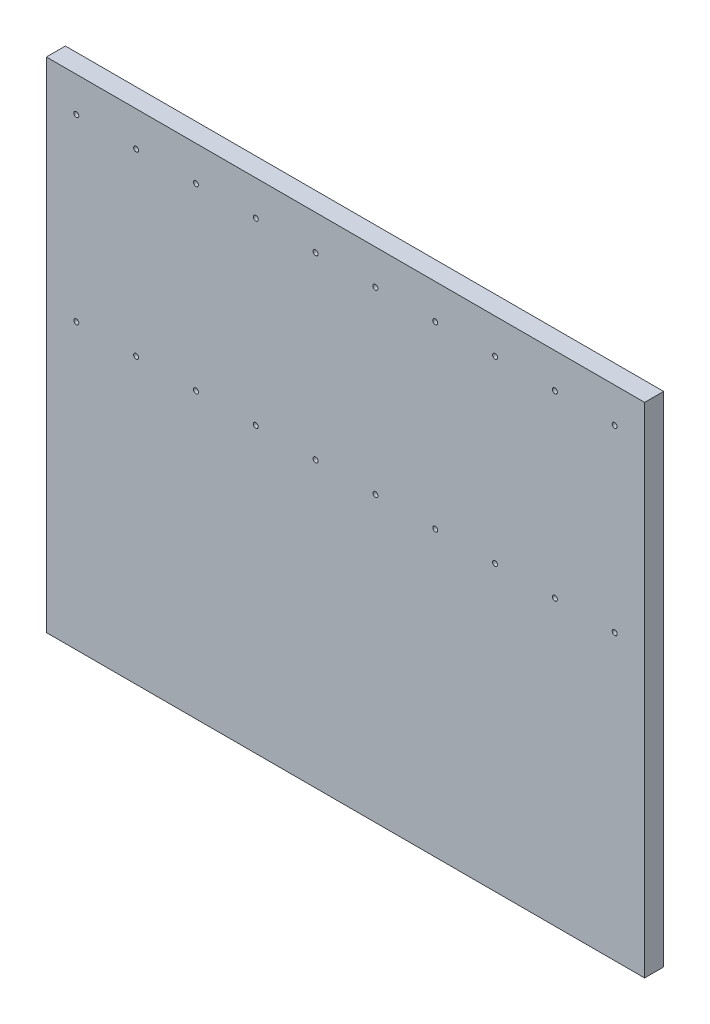
ISO-10303-21;
HEADER;
FILE_DESCRIPTION(('STEP AP214'),'2;1');
FILE_NAME('part.step','',(''),(''),'','','');
FILE_SCHEMA(('AUTOMOTIVE_DESIGN { 1 0 10303 214 1 1 1 1 }'));
ENDSEC;
DATA;
#1=APPLICATION_CONTEXT('core data for automotive mechanical design processes');
#2=APPLICATION_PROTOCOL_DEFINITION('international standard','automotive_design',2000,#1);
#3=PRODUCT_CONTEXT('',#1,'mechanical');
#4=PRODUCT('Part','Part','',(#3));
#5=PRODUCT_RELATED_PRODUCT_CATEGORY('part','',(#4));
#6=PRODUCT_DEFINITION_FORMATION('','',#4);
#7=PRODUCT_DEFINITION_CONTEXT('part definition',#1,'design');
#8=PRODUCT_DEFINITION('design','',#6,#7);
#9=PRODUCT_DEFINITION_SHAPE('','',#8);
#10=(LENGTH_UNIT() NAMED_UNIT(*) SI_UNIT(.MILLI.,.METRE.));
#11=(NAMED_UNIT(*) PLANE_ANGLE_UNIT() SI_UNIT($,.RADIAN.));
#12=(NAMED_UNIT(*) SI_UNIT($,.STERADIAN.) SOLID_ANGLE_UNIT());
#13=UNCERTAINTY_MEASURE_WITH_UNIT(LENGTH_MEASURE(1.E-05),#10,'distance_accuracy_value','');
#14=(GEOMETRIC_REPRESENTATION_CONTEXT(3) GLOBAL_UNCERTAINTY_ASSIGNED_CONTEXT((#13)) GLOBAL_UNIT_ASSIGNED_CONTEXT((#10,
#11,#12)) REPRESENTATION_CONTEXT('',''));
#15=CARTESIAN_POINT('',(0.,0.,0.));
#16=DIRECTION('',(0.,0.,1.));
#17=DIRECTION('',(1.,0.,0.));
#18=AXIS2_PLACEMENT_3D('',#15,#16,#17);
#19=CARTESIAN_POINT('',(0.,-250.,19.05));
#20=DIRECTION('',(0.,1.,0.));
#21=DIRECTION('',(0.,0.,1.));
#22=AXIS2_PLACEMENT_3D('',#19,#20,#21);
#23=PLANE('',#22);
#24=DIRECTION('',(1.,0.,0.));
#25=VECTOR('',#24,1.);
#26=CARTESIAN_POINT('',(0.,-250.,0.));
#27=LINE('',#26,#25);
#28=CARTESIAN_POINT('',(-300.,-250.,0.));
#29=VERTEX_POINT('',#28);
#30=CARTESIAN_POINT('',(300.,-250.,0.));
#31=VERTEX_POINT('',#30);
#32=EDGE_CURVE('E98',#29,#31,#27,.T.);
#33=ORIENTED_EDGE('',*,*,#32,.T.);
#34=DIRECTION('',(0.,0.,-1.));
#35=VECTOR('',#34,1.);
#36=CARTESIAN_POINT('',(300.,-250.,19.05));
#37=LINE('',#36,#35);
#38=CARTESIAN_POINT('',(300.,-250.,19.05));
#39=VERTEX_POINT('',#38);
#40=EDGE_CURVE('E11',#39,#31,#37,.T.);
#41=ORIENTED_EDGE('',*,*,#40,.F.);
#42=DIRECTION('',(1.,0.,0.));
#43=VECTOR('',#42,1.);
#44=CARTESIAN_POINT('',(0.,-250.,19.05));
#45=LINE('',#44,#43);
#46=CARTESIAN_POINT('',(-300.,-250.,19.05));
#47=VERTEX_POINT('',#46);
#48=EDGE_CURVE('E84',#47,#39,#45,.T.);
#49=ORIENTED_EDGE('',*,*,#48,.F.);
#50=DIRECTION('',(0.,0.,-1.));
#51=VECTOR('',#50,1.);
#52=CARTESIAN_POINT('',(-300.,-250.,19.05));
#53=LINE('',#52,#51);
#54=EDGE_CURVE('E51',#47,#29,#53,.T.);
#55=ORIENTED_EDGE('',*,*,#54,.T.);
#56=EDGE_LOOP('',(#33,#41,#49,#55));
#57=FACE_BOUND('',#56,.T.);
#58=ADVANCED_FACE('F35',(#57),#23,.F.);
#59=CARTESIAN_POINT('',(300.,0.,19.05));
#60=DIRECTION('',(-1.,0.,0.));
#61=DIRECTION('',(0.,0.,1.));
#62=AXIS2_PLACEMENT_3D('',#59,#60,#61);
#63=PLANE('',#62);
#64=DIRECTION('',(0.,1.,0.));
#65=VECTOR('',#64,1.);
#66=CARTESIAN_POINT('',(300.,0.,0.));
#67=LINE('',#66,#65);
#68=CARTESIAN_POINT('',(300.,250.,0.));
#69=VERTEX_POINT('',#68);
#70=EDGE_CURVE('E89',#31,#69,#67,.T.);
#71=ORIENTED_EDGE('',*,*,#70,.T.);
#72=DIRECTION('',(0.,0.,-1.));
#73=VECTOR('',#72,1.);
#74=CARTESIAN_POINT('',(300.,250.,19.05));
#75=LINE('',#74,#73);
#76=CARTESIAN_POINT('',(300.,250.,19.05));
#77=VERTEX_POINT('',#76);
#78=EDGE_CURVE('E43',#77,#69,#75,.T.);
#79=ORIENTED_EDGE('',*,*,#78,.F.);
#80=DIRECTION('',(0.,1.,0.));
#81=VECTOR('',#80,1.);
#82=CARTESIAN_POINT('',(300.,0.,19.05));
#83=LINE('',#82,#81);
#84=EDGE_CURVE('E77',#39,#77,#83,.T.);
#85=ORIENTED_EDGE('',*,*,#84,.F.);
#86=ORIENTED_EDGE('',*,*,#40,.T.);
#87=EDGE_LOOP('',(#71,#79,#85,#86));
#88=FACE_BOUND('',#87,.T.);
#89=ADVANCED_FACE('F88',(#88),#63,.F.);
#90=CARTESIAN_POINT('',(0.,250.,19.05));
#91=DIRECTION('',(0.,-1.,0.));
#92=DIRECTION('',(1.,0.,0.));
#93=AXIS2_PLACEMENT_3D('',#90,#91,#92);
#94=PLANE('',#93);
#95=DIRECTION('',(-1.,0.,0.));
#96=VECTOR('',#95,1.);
#97=CARTESIAN_POINT('',(0.,250.,0.));
#98=LINE('',#97,#96);
#99=CARTESIAN_POINT('',(-300.,250.,0.));
#100=VERTEX_POINT('',#99);
#101=EDGE_CURVE('E102',#69,#100,#98,.T.);
#102=ORIENTED_EDGE('',*,*,#101,.T.);
#103=DIRECTION('',(0.,0.,-1.));
#104=VECTOR('',#103,1.);
#105=CARTESIAN_POINT('',(-300.,250.,19.05));
#106=LINE('',#105,#104);
#107=CARTESIAN_POINT('',(-300.,250.,19.05));
#108=VERTEX_POINT('',#107);
#109=EDGE_CURVE('E66',#108,#100,#106,.T.);
#110=ORIENTED_EDGE('',*,*,#109,.F.);
#111=DIRECTION('',(-1.,0.,0.));
#112=VECTOR('',#111,1.);
#113=CARTESIAN_POINT('',(0.,250.,19.05));
#114=LINE('',#113,#112);
#115=EDGE_CURVE('E83',#77,#108,#114,.T.);
#116=ORIENTED_EDGE('',*,*,#115,.F.);
#117=ORIENTED_EDGE('',*,*,#78,.T.);
#118=EDGE_LOOP('',(#102,#110,#116,#117));
#119=FACE_BOUND('',#118,.T.);
#120=ADVANCED_FACE('F92',(#119),#94,.F.);
#121=CARTESIAN_POINT('',(-300.,0.,19.05));
#122=DIRECTION('',(-1.,0.,0.));
#123=DIRECTION('',(0.,0.,1.));
#124=AXIS2_PLACEMENT_3D('',#121,#122,#123);
#125=PLANE('',#124);
#126=DIRECTION('',(0.,1.,0.));
#127=VECTOR('',#126,1.);
#128=CARTESIAN_POINT('',(-300.,0.,0.));
#129=LINE('',#128,#127);
#130=EDGE_CURVE('E104',#29,#100,#129,.T.);
#131=ORIENTED_EDGE('',*,*,#130,.F.);
#132=ORIENTED_EDGE('',*,*,#54,.F.);
#133=DIRECTION('',(0.,1.,0.));
#134=VECTOR('',#133,1.);
#135=CARTESIAN_POINT('',(-300.,0.,19.05));
#136=LINE('',#135,#134);
#137=EDGE_CURVE('E93',#47,#108,#136,.T.);
#138=ORIENTED_EDGE('',*,*,#137,.T.);
#139=ORIENTED_EDGE('',*,*,#109,.T.);
#140=EDGE_LOOP('',(#131,#132,#138,#139));
#141=FACE_BOUND('',#140,.T.);
#142=ADVANCED_FACE('F242',(#141),#125,.T.);
#143=CARTESIAN_POINT('',(0.,0.,19.05));
#144=DIRECTION('',(0.,0.,1.));
#145=DIRECTION('',(1.,0.,0.));
#146=AXIS2_PLACEMENT_3D('',#143,#144,#145);
#147=PLANE('',#146);
#148=CARTESIAN_POINT('',(90.0000000000001,215.,19.05));
#149=DIRECTION('',(0.,0.,1.));
#150=DIRECTION('',(1.,0.,0.));
#151=AXIS2_PLACEMENT_3D('',#148,#149,#150);
#152=CIRCLE('',#151,2.5);
#153=CARTESIAN_POINT('',(92.5000000000001,215.,19.05));
#154=VERTEX_POINT('',#153);
#155=EDGE_CURVE('E164',#154,#154,#152,.T.);
#156=ORIENTED_EDGE('',*,*,#155,.F.);
#157=EDGE_LOOP('',(#156));
#158=FACE_BOUND('',#157,.T.);
#159=CARTESIAN_POINT('',(30.0000000000001,215.,19.05));
#160=DIRECTION('',(0.,0.,1.));
#161=DIRECTION('',(1.,0.,0.));
#162=AXIS2_PLACEMENT_3D('',#159,#160,#161);
#163=CIRCLE('',#162,2.50000000000002);
#164=CARTESIAN_POINT('',(32.5000000000001,215.,19.05));
#165=VERTEX_POINT('',#164);
#166=EDGE_CURVE('E171',#165,#165,#163,.T.);
#167=ORIENTED_EDGE('',*,*,#166,.F.);
#168=EDGE_LOOP('',(#167));
#169=FACE_BOUND('',#168,.T.);
#170=CARTESIAN_POINT('',(-29.9999999999999,215.,19.05));
#171=DIRECTION('',(0.,0.,1.));
#172=DIRECTION('',(1.,0.,0.));
#173=AXIS2_PLACEMENT_3D('',#170,#171,#172);
#174=CIRCLE('',#173,2.50000000000002);
#175=CARTESIAN_POINT('',(-27.4999999999999,215.,19.05));
#176=VERTEX_POINT('',#175);
#177=EDGE_CURVE('E177',#176,#176,#174,.T.);
#178=ORIENTED_EDGE('',*,*,#177,.F.);
#179=EDGE_LOOP('',(#178));
#180=FACE_BOUND('',#179,.T.);
#181=CARTESIAN_POINT('',(-89.9999999999999,215.,19.05));
#182=DIRECTION('',(0.,0.,1.));
#183=DIRECTION('',(1.,0.,0.));
#184=AXIS2_PLACEMENT_3D('',#181,#182,#183);
#185=CIRCLE('',#184,2.5);
#186=CARTESIAN_POINT('',(-87.4999999999999,215.,19.05));
#187=VERTEX_POINT('',#186);
#188=EDGE_CURVE('E183',#187,#187,#185,.T.);
#189=ORIENTED_EDGE('',*,*,#188,.F.);
#190=EDGE_LOOP('',(#189));
#191=FACE_BOUND('',#190,.T.);
#192=CARTESIAN_POINT('',(-150.,215.,19.05));
#193=DIRECTION('',(0.,0.,1.));
#194=DIRECTION('',(1.,0.,0.));
#195=AXIS2_PLACEMENT_3D('',#192,#193,#194);
#196=CIRCLE('',#195,2.50000000000002);
#197=CARTESIAN_POINT('',(-147.5,215.,19.05));
#198=VERTEX_POINT('',#197);
#199=EDGE_CURVE('E189',#198,#198,#196,.T.);
#200=ORIENTED_EDGE('',*,*,#199,.F.);
#201=EDGE_LOOP('',(#200));
#202=FACE_BOUND('',#201,.T.);
#203=CARTESIAN_POINT('',(-210.,215.,19.05));
#204=DIRECTION('',(0.,0.,1.));
#205=DIRECTION('',(1.,0.,0.));
#206=AXIS2_PLACEMENT_3D('',#203,#204,#205);
#207=CIRCLE('',#206,2.50000000000002);
#208=CARTESIAN_POINT('',(-207.5,215.,19.05));
#209=VERTEX_POINT('',#208);
#210=EDGE_CURVE('E195',#209,#209,#207,.T.);
#211=ORIENTED_EDGE('',*,*,#210,.F.);
#212=EDGE_LOOP('',(#211));
#213=FACE_BOUND('',#212,.T.);
#214=CARTESIAN_POINT('',(-270.,215.,19.05));
#215=DIRECTION('',(0.,0.,1.));
#216=DIRECTION('',(1.,0.,0.));
#217=AXIS2_PLACEMENT_3D('',#214,#215,#216);
#218=CIRCLE('',#217,2.50000000000002);
#219=CARTESIAN_POINT('',(-267.5,215.,19.05));
#220=VERTEX_POINT('',#219);
#221=EDGE_CURVE('E201',#220,#220,#218,.T.);
#222=ORIENTED_EDGE('',*,*,#221,.F.);
#223=EDGE_LOOP('',(#222));
#224=FACE_BOUND('',#223,.T.);
#225=CARTESIAN_POINT('',(-269.99999999999,35.,19.05));
#226=DIRECTION('',(0.,0.,1.));
#227=DIRECTION('',(1.,0.,0.));
#228=AXIS2_PLACEMENT_3D('',#225,#226,#227);
#229=CIRCLE('',#228,2.50000000000002);
#230=CARTESIAN_POINT('',(-267.49999999999,35.,19.05));
#231=VERTEX_POINT('',#230);
#232=EDGE_CURVE('E207',#231,#231,#229,.T.);
#233=ORIENTED_EDGE('',*,*,#232,.F.);
#234=EDGE_LOOP('',(#233));
#235=FACE_BOUND('',#234,.T.);
#236=CARTESIAN_POINT('',(-209.999999999988,35.,19.05));
#237=DIRECTION('',(0.,0.,1.));
#238=DIRECTION('',(1.,0.,0.));
#239=AXIS2_PLACEMENT_3D('',#236,#237,#238);
#240=CIRCLE('',#239,2.50000000000002);
#241=CARTESIAN_POINT('',(-207.499999999988,35.,19.05));
#242=VERTEX_POINT('',#241);
#243=EDGE_CURVE('E116',#242,#242,#240,.T.);
#244=ORIENTED_EDGE('',*,*,#243,.F.);
#245=EDGE_LOOP('',(#244));
#246=FACE_BOUND('',#245,.T.);
#247=CARTESIAN_POINT('',(-149.999999999988,35.,19.05));
#248=DIRECTION('',(0.,0.,1.));
#249=DIRECTION('',(1.,0.,0.));
#250=AXIS2_PLACEMENT_3D('',#247,#248,#249);
#251=CIRCLE('',#250,2.50000000000002);
#252=CARTESIAN_POINT('',(-147.499999999988,35.,19.05));
#253=VERTEX_POINT('',#252);
#254=EDGE_CURVE('E123',#253,#253,#251,.T.);
#255=ORIENTED_EDGE('',*,*,#254,.F.);
#256=EDGE_LOOP('',(#255));
#257=FACE_BOUND('',#256,.T.);
#258=CARTESIAN_POINT('',(-89.9999999999878,35.,19.05));
#259=DIRECTION('',(0.,0.,1.));
#260=DIRECTION('',(1.,0.,0.));
#261=AXIS2_PLACEMENT_3D('',#258,#259,#260);
#262=CIRCLE('',#261,2.5);
#263=CARTESIAN_POINT('',(-87.4999999999878,35.,19.05));
#264=VERTEX_POINT('',#263);
#265=EDGE_CURVE('E129',#264,#264,#262,.T.);
#266=ORIENTED_EDGE('',*,*,#265,.F.);
#267=EDGE_LOOP('',(#266));
#268=FACE_BOUND('',#267,.T.);
#269=CARTESIAN_POINT('',(-29.9999999999878,35.,19.05));
#270=DIRECTION('',(0.,0.,1.));
#271=DIRECTION('',(1.,0.,0.));
#272=AXIS2_PLACEMENT_3D('',#269,#270,#271);
#273=CIRCLE('',#272,2.50000000000002);
#274=CARTESIAN_POINT('',(-27.4999999999878,35.,19.05));
#275=VERTEX_POINT('',#274);
#276=EDGE_CURVE('E135',#275,#275,#273,.T.);
#277=ORIENTED_EDGE('',*,*,#276,.F.);
#278=EDGE_LOOP('',(#277));
#279=FACE_BOUND('',#278,.T.);
#280=CARTESIAN_POINT('',(30.0000000000122,35.,19.05));
#281=DIRECTION('',(0.,0.,1.));
#282=DIRECTION('',(1.,0.,0.));
#283=AXIS2_PLACEMENT_3D('',#280,#281,#282);
#284=CIRCLE('',#283,2.50000000000002);
#285=CARTESIAN_POINT('',(32.5000000000122,35.,19.05));
#286=VERTEX_POINT('',#285);
#287=EDGE_CURVE('E141',#286,#286,#284,.T.);
#288=ORIENTED_EDGE('',*,*,#287,.F.);
#289=EDGE_LOOP('',(#288));
#290=FACE_BOUND('',#289,.T.);
#291=CARTESIAN_POINT('',(90.0000000000122,35.,19.05));
#292=DIRECTION('',(0.,0.,1.));
#293=DIRECTION('',(1.,0.,0.));
#294=AXIS2_PLACEMENT_3D('',#291,#292,#293);
#295=CIRCLE('',#294,2.5);
#296=CARTESIAN_POINT('',(92.5000000000122,35.,19.05));
#297=VERTEX_POINT('',#296);
#298=EDGE_CURVE('E147',#297,#297,#295,.T.);
#299=ORIENTED_EDGE('',*,*,#298,.F.);
#300=EDGE_LOOP('',(#299));
#301=FACE_BOUND('',#300,.T.);
#302=CARTESIAN_POINT('',(150.000000000012,35.,19.05));
#303=DIRECTION('',(0.,0.,1.));
#304=DIRECTION('',(1.,0.,0.));
#305=AXIS2_PLACEMENT_3D('',#302,#303,#304);
#306=CIRCLE('',#305,2.50000000000002);
#307=CARTESIAN_POINT('',(152.500000000012,35.,19.05));
#308=VERTEX_POINT('',#307);
#309=EDGE_CURVE('E153',#308,#308,#306,.T.);
#310=ORIENTED_EDGE('',*,*,#309,.F.);
#311=EDGE_LOOP('',(#310));
#312=FACE_BOUND('',#311,.T.);
#313=CARTESIAN_POINT('',(210.000000000012,35.,19.05));
#314=DIRECTION('',(0.,0.,1.));
#315=DIRECTION('',(1.,0.,0.));
#316=AXIS2_PLACEMENT_3D('',#313,#314,#315);
#317=CIRCLE('',#316,2.50000000000002);
#318=CARTESIAN_POINT('',(212.500000000012,35.,19.05));
#319=VERTEX_POINT('',#318);
#320=EDGE_CURVE('E159',#319,#319,#317,.T.);
#321=ORIENTED_EDGE('',*,*,#320,.F.);
#322=EDGE_LOOP('',(#321));
#323=FACE_BOUND('',#322,.T.);
#324=CARTESIAN_POINT('',(150.,215.,19.05));
#325=DIRECTION('',(0.,0.,1.));
#326=DIRECTION('',(1.,0.,0.));
#327=AXIS2_PLACEMENT_3D('',#324,#325,#326);
#328=CIRCLE('',#327,2.50000000000002);
#329=CARTESIAN_POINT('',(152.5,215.,19.05));
#330=VERTEX_POINT('',#329);
#331=EDGE_CURVE('E224',#330,#330,#328,.T.);
#332=ORIENTED_EDGE('',*,*,#331,.F.);
#333=EDGE_LOOP('',(#332));
#334=FACE_BOUND('',#333,.T.);
#335=CARTESIAN_POINT('',(210.,215.,19.05));
#336=DIRECTION('',(0.,0.,1.));
#337=DIRECTION('',(1.,0.,0.));
#338=AXIS2_PLACEMENT_3D('',#335,#336,#337);
#339=CIRCLE('',#338,2.50000000000002);
#340=CARTESIAN_POINT('',(212.5,215.,19.05));
#341=VERTEX_POINT('',#340);
#342=EDGE_CURVE('E218',#341,#341,#339,.T.);
#343=ORIENTED_EDGE('',*,*,#342,.F.);
#344=EDGE_LOOP('',(#343));
#345=FACE_BOUND('',#344,.T.);
#346=CARTESIAN_POINT('',(270.,215.,19.05));
#347=DIRECTION('',(0.,0.,1.));
#348=DIRECTION('',(1.,0.,0.));
#349=AXIS2_PLACEMENT_3D('',#346,#347,#348);
#350=CIRCLE('',#349,2.50000000000002);
#351=CARTESIAN_POINT('',(272.5,215.,19.05));
#352=VERTEX_POINT('',#351);
#353=EDGE_CURVE('E212',#352,#352,#350,.T.);
#354=ORIENTED_EDGE('',*,*,#353,.F.);
#355=EDGE_LOOP('',(#354));
#356=FACE_BOUND('',#355,.T.);
#357=CARTESIAN_POINT('',(270.000000000012,35.,19.05));
#358=DIRECTION('',(0.,0.,1.));
#359=DIRECTION('',(1.,0.,0.));
#360=AXIS2_PLACEMENT_3D('',#357,#358,#359);
#361=CIRCLE('',#360,2.50000000000002);
#362=CARTESIAN_POINT('',(272.500000000012,35.,19.05));
#363=VERTEX_POINT('',#362);
#364=EDGE_CURVE('E110',#363,#363,#361,.T.);
#365=ORIENTED_EDGE('',*,*,#364,.F.);
#366=EDGE_LOOP('',(#365));
#367=FACE_BOUND('',#366,.T.);
#368=ORIENTED_EDGE('',*,*,#48,.T.);
#369=ORIENTED_EDGE('',*,*,#84,.T.);
#370=ORIENTED_EDGE('',*,*,#115,.T.);
#371=ORIENTED_EDGE('',*,*,#137,.F.);
#372=EDGE_LOOP('',(#368,#369,#370,#371));
#373=FACE_BOUND('',#372,.T.);
#374=ADVANCED_FACE('F80',(#158,#169,#180,#191,#202,#213,#224,#235,#246,#257,#268,#279,#290,#301,
#312,#323,#334,#345,#356,#367,#373),#147,.T.);
#375=CARTESIAN_POINT('',(0.,0.,0.));
#376=DIRECTION('',(0.,0.,1.));
#377=DIRECTION('',(1.,0.,0.));
#378=AXIS2_PLACEMENT_3D('',#375,#376,#377);
#379=PLANE('',#378);
#380=ORIENTED_EDGE('',*,*,#32,.F.);
#381=ORIENTED_EDGE('',*,*,#130,.T.);
#382=ORIENTED_EDGE('',*,*,#101,.F.);
#383=ORIENTED_EDGE('',*,*,#70,.F.);
#384=EDGE_LOOP('',(#380,#381,#382,#383));
#385=FACE_BOUND('',#384,.T.);
#386=ADVANCED_FACE('F241',(#385),#379,.F.);
#387=CARTESIAN_POINT('',(270.000000000012,35.,14.05));
#388=DIRECTION('',(0.,0.,1.));
#389=DIRECTION('',(1.,0.,0.));
#390=AXIS2_PLACEMENT_3D('',#387,#388,#389);
#391=CYLINDRICAL_SURFACE('',#390,2.50000000000002);
#392=CARTESIAN_POINT('',(270.000000000012,35.,14.05));
#393=DIRECTION('',(0.,0.,1.));
#394=DIRECTION('',(1.,0.,0.));
#395=AXIS2_PLACEMENT_3D('',#392,#393,#394);
#396=CIRCLE('',#395,2.50000000000002);
#397=CARTESIAN_POINT('',(272.500000000012,35.,14.05));
#398=VERTEX_POINT('',#397);
#399=EDGE_CURVE('E100',#398,#398,#396,.T.);
#400=ORIENTED_EDGE('',*,*,#399,.F.);
#401=EDGE_LOOP('',(#400));
#402=FACE_BOUND('',#401,.T.);
#403=ORIENTED_EDGE('',*,*,#364,.T.);
#404=EDGE_LOOP('',(#403));
#405=FACE_BOUND('',#404,.T.);
#406=ADVANCED_FACE('F251',(#402,#405),#391,.F.);
#407=CARTESIAN_POINT('',(270.000000000012,35.,14.05));
#408=DIRECTION('',(0.,0.,1.));
#409=DIRECTION('',(1.,0.,0.));
#410=AXIS2_PLACEMENT_3D('',#407,#408,#409);
#411=PLANE('',#410);
#412=ORIENTED_EDGE('',*,*,#399,.T.);
#413=EDGE_LOOP('',(#412));
#414=FACE_BOUND('',#413,.T.);
#415=ADVANCED_FACE('F253',(#414),#411,.T.);
#416=CARTESIAN_POINT('',(270.,215.,14.05));
#417=DIRECTION('',(0.,0.,1.));
#418=DIRECTION('',(1.,0.,0.));
#419=AXIS2_PLACEMENT_3D('',#416,#417,#418);
#420=CYLINDRICAL_SURFACE('',#419,2.50000000000002);
#421=CARTESIAN_POINT('',(270.,215.,14.05));
#422=DIRECTION('',(0.,0.,1.));
#423=DIRECTION('',(1.,0.,0.));
#424=AXIS2_PLACEMENT_3D('',#421,#422,#423);
#425=CIRCLE('',#424,2.50000000000002);
#426=CARTESIAN_POINT('',(272.5,215.,14.05));
#427=VERTEX_POINT('',#426);
#428=EDGE_CURVE('E215',#427,#427,#425,.T.);
#429=ORIENTED_EDGE('',*,*,#428,.F.);
#430=EDGE_LOOP('',(#429));
#431=FACE_BOUND('',#430,.T.);
#432=ORIENTED_EDGE('',*,*,#353,.T.);
#433=EDGE_LOOP('',(#432));
#434=FACE_BOUND('',#433,.T.);
#435=ADVANCED_FACE('F260',(#431,#434),#420,.F.);
#436=CARTESIAN_POINT('',(270.,215.,14.05));
#437=DIRECTION('',(0.,0.,1.));
#438=DIRECTION('',(1.,0.,0.));
#439=AXIS2_PLACEMENT_3D('',#436,#437,#438);
#440=PLANE('',#439);
#441=ORIENTED_EDGE('',*,*,#428,.T.);
#442=EDGE_LOOP('',(#441));
#443=FACE_BOUND('',#442,.T.);
#444=ADVANCED_FACE('F326',(#443),#440,.T.);
#445=CARTESIAN_POINT('',(210.,215.,14.05));
#446=DIRECTION('',(0.,0.,1.));
#447=DIRECTION('',(1.,0.,0.));
#448=AXIS2_PLACEMENT_3D('',#445,#446,#447);
#449=CYLINDRICAL_SURFACE('',#448,2.50000000000002);
#450=CARTESIAN_POINT('',(210.,215.,14.05));
#451=DIRECTION('',(0.,0.,1.));
#452=DIRECTION('',(1.,0.,0.));
#453=AXIS2_PLACEMENT_3D('',#450,#451,#452);
#454=CIRCLE('',#453,2.50000000000002);
#455=CARTESIAN_POINT('',(212.5,215.,14.05));
#456=VERTEX_POINT('',#455);
#457=EDGE_CURVE('E221',#456,#456,#454,.T.);
#458=ORIENTED_EDGE('',*,*,#457,.F.);
#459=EDGE_LOOP('',(#458));
#460=FACE_BOUND('',#459,.T.);
#461=ORIENTED_EDGE('',*,*,#342,.T.);
#462=EDGE_LOOP('',(#461));
#463=FACE_BOUND('',#462,.T.);
#464=ADVANCED_FACE('F335',(#460,#463),#449,.F.);
#465=CARTESIAN_POINT('',(210.,215.,14.05));
#466=DIRECTION('',(0.,0.,1.));
#467=DIRECTION('',(1.,0.,0.));
#468=AXIS2_PLACEMENT_3D('',#465,#466,#467);
#469=PLANE('',#468);
#470=ORIENTED_EDGE('',*,*,#457,.T.);
#471=EDGE_LOOP('',(#470));
#472=FACE_BOUND('',#471,.T.);
#473=ADVANCED_FACE('F235',(#472),#469,.T.);
#474=CARTESIAN_POINT('',(150.,215.,14.05));
#475=DIRECTION('',(0.,0.,1.));
#476=DIRECTION('',(1.,0.,0.));
#477=AXIS2_PLACEMENT_3D('',#474,#475,#476);
#478=CYLINDRICAL_SURFACE('',#477,2.50000000000002);
#479=CARTESIAN_POINT('',(150.,215.,14.05));
#480=DIRECTION('',(0.,0.,1.));
#481=DIRECTION('',(1.,0.,0.));
#482=AXIS2_PLACEMENT_3D('',#479,#480,#481);
#483=CIRCLE('',#482,2.50000000000002);
#484=CARTESIAN_POINT('',(152.5,215.,14.05));
#485=VERTEX_POINT('',#484);
#486=EDGE_CURVE('E168',#485,#485,#483,.T.);
#487=ORIENTED_EDGE('',*,*,#486,.F.);
#488=EDGE_LOOP('',(#487));
#489=FACE_BOUND('',#488,.T.);
#490=ORIENTED_EDGE('',*,*,#331,.T.);
#491=EDGE_LOOP('',(#490));
#492=FACE_BOUND('',#491,.T.);
#493=ADVANCED_FACE('F232',(#489,#492),#478,.F.);
#494=CARTESIAN_POINT('',(150.,215.,14.05));
#495=DIRECTION('',(0.,0.,1.));
#496=DIRECTION('',(1.,0.,0.));
#497=AXIS2_PLACEMENT_3D('',#494,#495,#496);
#498=PLANE('',#497);
#499=ORIENTED_EDGE('',*,*,#486,.T.);
#500=EDGE_LOOP('',(#499));
#501=FACE_BOUND('',#500,.T.);
#502=ADVANCED_FACE('F230',(#501),#498,.T.);
#503=CARTESIAN_POINT('',(210.000000000012,35.,14.05));
#504=DIRECTION('',(0.,0.,1.));
#505=DIRECTION('',(1.,0.,0.));
#506=AXIS2_PLACEMENT_3D('',#503,#504,#505);
#507=CYLINDRICAL_SURFACE('',#506,2.50000000000002);
#508=CARTESIAN_POINT('',(210.000000000012,35.,14.05));
#509=DIRECTION('',(0.,0.,1.));
#510=DIRECTION('',(1.,0.,0.));
#511=AXIS2_PLACEMENT_3D('',#508,#509,#510);
#512=CIRCLE('',#511,2.50000000000002);
#513=CARTESIAN_POINT('',(212.500000000012,35.,14.05));
#514=VERTEX_POINT('',#513);
#515=EDGE_CURVE('E113',#514,#514,#512,.T.);
#516=ORIENTED_EDGE('',*,*,#515,.F.);
#517=EDGE_LOOP('',(#516));
#518=FACE_BOUND('',#517,.T.);
#519=ORIENTED_EDGE('',*,*,#320,.T.);
#520=EDGE_LOOP('',(#519));
#521=FACE_BOUND('',#520,.T.);
#522=ADVANCED_FACE('F365',(#518,#521),#507,.F.);
#523=CARTESIAN_POINT('',(210.000000000012,35.,14.05));
#524=DIRECTION('',(0.,0.,1.));
#525=DIRECTION('',(1.,0.,0.));
#526=AXIS2_PLACEMENT_3D('',#523,#524,#525);
#527=PLANE('',#526);
#528=ORIENTED_EDGE('',*,*,#515,.T.);
#529=EDGE_LOOP('',(#528));
#530=FACE_BOUND('',#529,.T.);
#531=ADVANCED_FACE('F373',(#530),#527,.T.);
#532=CARTESIAN_POINT('',(150.000000000012,35.,14.05));
#533=DIRECTION('',(0.,0.,1.));
#534=DIRECTION('',(1.,0.,0.));
#535=AXIS2_PLACEMENT_3D('',#532,#533,#534);
#536=CYLINDRICAL_SURFACE('',#535,2.50000000000002);
#537=CARTESIAN_POINT('',(150.000000000012,35.,14.05));
#538=DIRECTION('',(0.,0.,1.));
#539=DIRECTION('',(1.,0.,0.));
#540=AXIS2_PLACEMENT_3D('',#537,#538,#539);
#541=CIRCLE('',#540,2.50000000000002);
#542=CARTESIAN_POINT('',(152.500000000012,35.,14.05));
#543=VERTEX_POINT('',#542);
#544=EDGE_CURVE('E156',#543,#543,#541,.T.);
#545=ORIENTED_EDGE('',*,*,#544,.F.);
#546=EDGE_LOOP('',(#545));
#547=FACE_BOUND('',#546,.T.);
#548=ORIENTED_EDGE('',*,*,#309,.T.);
#549=EDGE_LOOP('',(#548));
#550=FACE_BOUND('',#549,.T.);
#551=ADVANCED_FACE('F382',(#547,#550),#536,.F.);
#552=CARTESIAN_POINT('',(150.000000000012,35.,14.05));
#553=DIRECTION('',(0.,0.,1.));
#554=DIRECTION('',(1.,0.,0.));
#555=AXIS2_PLACEMENT_3D('',#552,#553,#554);
#556=PLANE('',#555);
#557=ORIENTED_EDGE('',*,*,#544,.T.);
#558=EDGE_LOOP('',(#557));
#559=FACE_BOUND('',#558,.T.);
#560=ADVANCED_FACE('F391',(#559),#556,.T.);
#561=CARTESIAN_POINT('',(90.0000000000122,35.,14.05));
#562=DIRECTION('',(0.,0.,1.));
#563=DIRECTION('',(1.,0.,0.));
#564=AXIS2_PLACEMENT_3D('',#561,#562,#563);
#565=CYLINDRICAL_SURFACE('',#564,2.5);
#566=CARTESIAN_POINT('',(90.0000000000122,35.,14.05));
#567=DIRECTION('',(0.,0.,1.));
#568=DIRECTION('',(1.,0.,0.));
#569=AXIS2_PLACEMENT_3D('',#566,#567,#568);
#570=CIRCLE('',#569,2.5);
#571=CARTESIAN_POINT('',(92.5000000000122,35.,14.05));
#572=VERTEX_POINT('',#571);
#573=EDGE_CURVE('E150',#572,#572,#570,.T.);
#574=ORIENTED_EDGE('',*,*,#573,.F.);
#575=EDGE_LOOP('',(#574));
#576=FACE_BOUND('',#575,.T.);
#577=ORIENTED_EDGE('',*,*,#298,.T.);
#578=EDGE_LOOP('',(#577));
#579=FACE_BOUND('',#578,.T.);
#580=ADVANCED_FACE('F400',(#576,#579),#565,.F.);
#581=CARTESIAN_POINT('',(90.0000000000122,35.,14.05));
#582=DIRECTION('',(0.,0.,1.));
#583=DIRECTION('',(1.,0.,0.));
#584=AXIS2_PLACEMENT_3D('',#581,#582,#583);
#585=PLANE('',#584);
#586=ORIENTED_EDGE('',*,*,#573,.T.);
#587=EDGE_LOOP('',(#586));
#588=FACE_BOUND('',#587,.T.);
#589=ADVANCED_FACE('F409',(#588),#585,.T.);
#590=CARTESIAN_POINT('',(30.0000000000122,35.,14.05));
#591=DIRECTION('',(0.,0.,1.));
#592=DIRECTION('',(1.,0.,0.));
#593=AXIS2_PLACEMENT_3D('',#590,#591,#592);
#594=CYLINDRICAL_SURFACE('',#593,2.50000000000002);
#595=CARTESIAN_POINT('',(30.0000000000122,35.,14.05));
#596=DIRECTION('',(0.,0.,1.));
#597=DIRECTION('',(1.,0.,0.));
#598=AXIS2_PLACEMENT_3D('',#595,#596,#597);
#599=CIRCLE('',#598,2.50000000000002);
#600=CARTESIAN_POINT('',(32.5000000000122,35.,14.05));
#601=VERTEX_POINT('',#600);
#602=EDGE_CURVE('E144',#601,#601,#599,.T.);
#603=ORIENTED_EDGE('',*,*,#602,.F.);
#604=EDGE_LOOP('',(#603));
#605=FACE_BOUND('',#604,.T.);
#606=ORIENTED_EDGE('',*,*,#287,.T.);
#607=EDGE_LOOP('',(#606));
#608=FACE_BOUND('',#607,.T.);
#609=ADVANCED_FACE('F418',(#605,#608),#594,.F.);
#610=CARTESIAN_POINT('',(30.0000000000122,35.,14.05));
#611=DIRECTION('',(0.,0.,1.));
#612=DIRECTION('',(1.,0.,0.));
#613=AXIS2_PLACEMENT_3D('',#610,#611,#612);
#614=PLANE('',#613);
#615=ORIENTED_EDGE('',*,*,#602,.T.);
#616=EDGE_LOOP('',(#615));
#617=FACE_BOUND('',#616,.T.);
#618=ADVANCED_FACE('F427',(#617),#614,.T.);
#619=CARTESIAN_POINT('',(-29.9999999999878,35.,14.05));
#620=DIRECTION('',(0.,0.,1.));
#621=DIRECTION('',(1.,0.,0.));
#622=AXIS2_PLACEMENT_3D('',#619,#620,#621);
#623=CYLINDRICAL_SURFACE('',#622,2.50000000000002);
#624=CARTESIAN_POINT('',(-29.9999999999878,35.,14.05));
#625=DIRECTION('',(0.,0.,1.));
#626=DIRECTION('',(1.,0.,0.));
#627=AXIS2_PLACEMENT_3D('',#624,#625,#626);
#628=CIRCLE('',#627,2.50000000000002);
#629=CARTESIAN_POINT('',(-27.4999999999878,35.,14.05));
#630=VERTEX_POINT('',#629);
#631=EDGE_CURVE('E138',#630,#630,#628,.T.);
#632=ORIENTED_EDGE('',*,*,#631,.F.);
#633=EDGE_LOOP('',(#632));
#634=FACE_BOUND('',#633,.T.);
#635=ORIENTED_EDGE('',*,*,#276,.T.);
#636=EDGE_LOOP('',(#635));
#637=FACE_BOUND('',#636,.T.);
#638=ADVANCED_FACE('F436',(#634,#637),#623,.F.);
#639=CARTESIAN_POINT('',(-29.9999999999878,35.,14.05));
#640=DIRECTION('',(0.,0.,1.));
#641=DIRECTION('',(1.,0.,0.));
#642=AXIS2_PLACEMENT_3D('',#639,#640,#641);
#643=PLANE('',#642);
#644=ORIENTED_EDGE('',*,*,#631,.T.);
#645=EDGE_LOOP('',(#644));
#646=FACE_BOUND('',#645,.T.);
#647=ADVANCED_FACE('F445',(#646),#643,.T.);
#648=CARTESIAN_POINT('',(-89.9999999999878,35.,14.05));
#649=DIRECTION('',(0.,0.,1.));
#650=DIRECTION('',(1.,0.,0.));
#651=AXIS2_PLACEMENT_3D('',#648,#649,#650);
#652=CYLINDRICAL_SURFACE('',#651,2.5);
#653=CARTESIAN_POINT('',(-89.9999999999878,35.,14.05));
#654=DIRECTION('',(0.,0.,1.));
#655=DIRECTION('',(1.,0.,0.));
#656=AXIS2_PLACEMENT_3D('',#653,#654,#655);
#657=CIRCLE('',#656,2.5);
#658=CARTESIAN_POINT('',(-87.4999999999878,35.,14.05));
#659=VERTEX_POINT('',#658);
#660=EDGE_CURVE('E132',#659,#659,#657,.T.);
#661=ORIENTED_EDGE('',*,*,#660,.F.);
#662=EDGE_LOOP('',(#661));
#663=FACE_BOUND('',#662,.T.);
#664=ORIENTED_EDGE('',*,*,#265,.T.);
#665=EDGE_LOOP('',(#664));
#666=FACE_BOUND('',#665,.T.);
#667=ADVANCED_FACE('F454',(#663,#666),#652,.F.);
#668=CARTESIAN_POINT('',(-89.9999999999878,35.,14.05));
#669=DIRECTION('',(0.,0.,1.));
#670=DIRECTION('',(1.,0.,0.));
#671=AXIS2_PLACEMENT_3D('',#668,#669,#670);
#672=PLANE('',#671);
#673=ORIENTED_EDGE('',*,*,#660,.T.);
#674=EDGE_LOOP('',(#673));
#675=FACE_BOUND('',#674,.T.);
#676=ADVANCED_FACE('F463',(#675),#672,.T.);
#677=CARTESIAN_POINT('',(-149.999999999988,35.,14.05));
#678=DIRECTION('',(0.,0.,1.));
#679=DIRECTION('',(1.,0.,0.));
#680=AXIS2_PLACEMENT_3D('',#677,#678,#679);
#681=CYLINDRICAL_SURFACE('',#680,2.50000000000002);
#682=CARTESIAN_POINT('',(-149.999999999988,35.,14.05));
#683=DIRECTION('',(0.,0.,1.));
#684=DIRECTION('',(1.,0.,0.));
#685=AXIS2_PLACEMENT_3D('',#682,#683,#684);
#686=CIRCLE('',#685,2.50000000000002);
#687=CARTESIAN_POINT('',(-147.499999999988,35.,14.05));
#688=VERTEX_POINT('',#687);
#689=EDGE_CURVE('E126',#688,#688,#686,.T.);
#690=ORIENTED_EDGE('',*,*,#689,.F.);
#691=EDGE_LOOP('',(#690));
#692=FACE_BOUND('',#691,.T.);
#693=ORIENTED_EDGE('',*,*,#254,.T.);
#694=EDGE_LOOP('',(#693));
#695=FACE_BOUND('',#694,.T.);
#696=ADVANCED_FACE('F472',(#692,#695),#681,.F.);
#697=CARTESIAN_POINT('',(-149.999999999988,35.,14.05));
#698=DIRECTION('',(0.,0.,1.));
#699=DIRECTION('',(1.,0.,0.));
#700=AXIS2_PLACEMENT_3D('',#697,#698,#699);
#701=PLANE('',#700);
#702=ORIENTED_EDGE('',*,*,#689,.T.);
#703=EDGE_LOOP('',(#702));
#704=FACE_BOUND('',#703,.T.);
#705=ADVANCED_FACE('F481',(#704),#701,.T.);
#706=CARTESIAN_POINT('',(-209.999999999988,35.,14.05));
#707=DIRECTION('',(0.,0.,1.));
#708=DIRECTION('',(1.,0.,0.));
#709=AXIS2_PLACEMENT_3D('',#706,#707,#708);
#710=CYLINDRICAL_SURFACE('',#709,2.50000000000002);
#711=CARTESIAN_POINT('',(-209.999999999988,35.,14.05));
#712=DIRECTION('',(0.,0.,1.));
#713=DIRECTION('',(1.,0.,0.));
#714=AXIS2_PLACEMENT_3D('',#711,#712,#713);
#715=CIRCLE('',#714,2.50000000000002);
#716=CARTESIAN_POINT('',(-207.499999999988,35.,14.05));
#717=VERTEX_POINT('',#716);
#718=EDGE_CURVE('E119',#717,#717,#715,.T.);
#719=ORIENTED_EDGE('',*,*,#718,.F.);
#720=EDGE_LOOP('',(#719));
#721=FACE_BOUND('',#720,.T.);
#722=ORIENTED_EDGE('',*,*,#243,.T.);
#723=EDGE_LOOP('',(#722));
#724=FACE_BOUND('',#723,.T.);
#725=ADVANCED_FACE('F490',(#721,#724),#710,.F.);
#726=CARTESIAN_POINT('',(-209.999999999988,35.,14.05));
#727=DIRECTION('',(0.,0.,1.));
#728=DIRECTION('',(1.,0.,0.));
#729=AXIS2_PLACEMENT_3D('',#726,#727,#728);
#730=PLANE('',#729);
#731=ORIENTED_EDGE('',*,*,#718,.T.);
#732=EDGE_LOOP('',(#731));
#733=FACE_BOUND('',#732,.T.);
#734=ADVANCED_FACE('F499',(#733),#730,.T.);
#735=CARTESIAN_POINT('',(-269.99999999999,35.,14.05));
#736=DIRECTION('',(0.,0.,1.));
#737=DIRECTION('',(1.,0.,0.));
#738=AXIS2_PLACEMENT_3D('',#735,#736,#737);
#739=CYLINDRICAL_SURFACE('',#738,2.50000000000002);
#740=CARTESIAN_POINT('',(-269.99999999999,35.,14.05));
#741=DIRECTION('',(0.,0.,1.));
#742=DIRECTION('',(1.,0.,0.));
#743=AXIS2_PLACEMENT_3D('',#740,#741,#742);
#744=CIRCLE('',#743,2.50000000000002);
#745=CARTESIAN_POINT('',(-267.49999999999,35.,14.05));
#746=VERTEX_POINT('',#745);
#747=EDGE_CURVE('E120',#746,#746,#744,.T.);
#748=ORIENTED_EDGE('',*,*,#747,.F.);
#749=EDGE_LOOP('',(#748));
#750=FACE_BOUND('',#749,.T.);
#751=ORIENTED_EDGE('',*,*,#232,.T.);
#752=EDGE_LOOP('',(#751));
#753=FACE_BOUND('',#752,.T.);
#754=ADVANCED_FACE('F508',(#750,#753),#739,.F.);
#755=CARTESIAN_POINT('',(-269.99999999999,35.,14.05));
#756=DIRECTION('',(0.,0.,1.));
#757=DIRECTION('',(1.,0.,0.));
#758=AXIS2_PLACEMENT_3D('',#755,#756,#757);
#759=PLANE('',#758);
#760=ORIENTED_EDGE('',*,*,#747,.T.);
#761=EDGE_LOOP('',(#760));
#762=FACE_BOUND('',#761,.T.);
#763=ADVANCED_FACE('F517',(#762),#759,.T.);
#764=CARTESIAN_POINT('',(-270.,215.,14.05));
#765=DIRECTION('',(0.,0.,1.));
#766=DIRECTION('',(1.,0.,0.));
#767=AXIS2_PLACEMENT_3D('',#764,#765,#766);
#768=CYLINDRICAL_SURFACE('',#767,2.50000000000002);
#769=CARTESIAN_POINT('',(-270.,215.,14.05));
#770=DIRECTION('',(0.,0.,1.));
#771=DIRECTION('',(1.,0.,0.));
#772=AXIS2_PLACEMENT_3D('',#769,#770,#771);
#773=CIRCLE('',#772,2.50000000000002);
#774=CARTESIAN_POINT('',(-267.5,215.,14.05));
#775=VERTEX_POINT('',#774);
#776=EDGE_CURVE('E204',#775,#775,#773,.T.);
#777=ORIENTED_EDGE('',*,*,#776,.F.);
#778=EDGE_LOOP('',(#777));
#779=FACE_BOUND('',#778,.T.);
#780=ORIENTED_EDGE('',*,*,#221,.T.);
#781=EDGE_LOOP('',(#780));
#782=FACE_BOUND('',#781,.T.);
#783=ADVANCED_FACE('F526',(#779,#782),#768,.F.);
#784=CARTESIAN_POINT('',(-270.,215.,14.05));
#785=DIRECTION('',(0.,0.,1.));
#786=DIRECTION('',(1.,0.,0.));
#787=AXIS2_PLACEMENT_3D('',#784,#785,#786);
#788=PLANE('',#787);
#789=ORIENTED_EDGE('',*,*,#776,.T.);
#790=EDGE_LOOP('',(#789));
#791=FACE_BOUND('',#790,.T.);
#792=ADVANCED_FACE('F535',(#791),#788,.T.);
#793=CARTESIAN_POINT('',(-210.,215.,14.05));
#794=DIRECTION('',(0.,0.,1.));
#795=DIRECTION('',(1.,0.,0.));
#796=AXIS2_PLACEMENT_3D('',#793,#794,#795);
#797=CYLINDRICAL_SURFACE('',#796,2.50000000000002);
#798=CARTESIAN_POINT('',(-210.,215.,14.05));
#799=DIRECTION('',(0.,0.,1.));
#800=DIRECTION('',(1.,0.,0.));
#801=AXIS2_PLACEMENT_3D('',#798,#799,#800);
#802=CIRCLE('',#801,2.50000000000002);
#803=CARTESIAN_POINT('',(-207.5,215.,14.05));
#804=VERTEX_POINT('',#803);
#805=EDGE_CURVE('E198',#804,#804,#802,.T.);
#806=ORIENTED_EDGE('',*,*,#805,.F.);
#807=EDGE_LOOP('',(#806));
#808=FACE_BOUND('',#807,.T.);
#809=ORIENTED_EDGE('',*,*,#210,.T.);
#810=EDGE_LOOP('',(#809));
#811=FACE_BOUND('',#810,.T.);
#812=ADVANCED_FACE('F544',(#808,#811),#797,.F.);
#813=CARTESIAN_POINT('',(-210.,215.,14.05));
#814=DIRECTION('',(0.,0.,1.));
#815=DIRECTION('',(1.,0.,0.));
#816=AXIS2_PLACEMENT_3D('',#813,#814,#815);
#817=PLANE('',#816);
#818=ORIENTED_EDGE('',*,*,#805,.T.);
#819=EDGE_LOOP('',(#818));
#820=FACE_BOUND('',#819,.T.);
#821=ADVANCED_FACE('F553',(#820),#817,.T.);
#822=CARTESIAN_POINT('',(-150.,215.,14.05));
#823=DIRECTION('',(0.,0.,1.));
#824=DIRECTION('',(1.,0.,0.));
#825=AXIS2_PLACEMENT_3D('',#822,#823,#824);
#826=CYLINDRICAL_SURFACE('',#825,2.50000000000002);
#827=CARTESIAN_POINT('',(-150.,215.,14.05));
#828=DIRECTION('',(0.,0.,1.));
#829=DIRECTION('',(1.,0.,0.));
#830=AXIS2_PLACEMENT_3D('',#827,#828,#829);
#831=CIRCLE('',#830,2.50000000000002);
#832=CARTESIAN_POINT('',(-147.5,215.,14.05));
#833=VERTEX_POINT('',#832);
#834=EDGE_CURVE('E192',#833,#833,#831,.T.);
#835=ORIENTED_EDGE('',*,*,#834,.F.);
#836=EDGE_LOOP('',(#835));
#837=FACE_BOUND('',#836,.T.);
#838=ORIENTED_EDGE('',*,*,#199,.T.);
#839=EDGE_LOOP('',(#838));
#840=FACE_BOUND('',#839,.T.);
#841=ADVANCED_FACE('F562',(#837,#840),#826,.F.);
#842=CARTESIAN_POINT('',(-150.,215.,14.05));
#843=DIRECTION('',(0.,0.,1.));
#844=DIRECTION('',(1.,0.,0.));
#845=AXIS2_PLACEMENT_3D('',#842,#843,#844);
#846=PLANE('',#845);
#847=ORIENTED_EDGE('',*,*,#834,.T.);
#848=EDGE_LOOP('',(#847));
#849=FACE_BOUND('',#848,.T.);
#850=ADVANCED_FACE('F571',(#849),#846,.T.);
#851=CARTESIAN_POINT('',(-89.9999999999999,215.,14.05));
#852=DIRECTION('',(0.,0.,1.));
#853=DIRECTION('',(1.,0.,0.));
#854=AXIS2_PLACEMENT_3D('',#851,#852,#853);
#855=CYLINDRICAL_SURFACE('',#854,2.5);
#856=CARTESIAN_POINT('',(-89.9999999999999,215.,14.05));
#857=DIRECTION('',(0.,0.,1.));
#858=DIRECTION('',(1.,0.,0.));
#859=AXIS2_PLACEMENT_3D('',#856,#857,#858);
#860=CIRCLE('',#859,2.5);
#861=CARTESIAN_POINT('',(-87.4999999999999,215.,14.05));
#862=VERTEX_POINT('',#861);
#863=EDGE_CURVE('E186',#862,#862,#860,.T.);
#864=ORIENTED_EDGE('',*,*,#863,.F.);
#865=EDGE_LOOP('',(#864));
#866=FACE_BOUND('',#865,.T.);
#867=ORIENTED_EDGE('',*,*,#188,.T.);
#868=EDGE_LOOP('',(#867));
#869=FACE_BOUND('',#868,.T.);
#870=ADVANCED_FACE('F580',(#866,#869),#855,.F.);
#871=CARTESIAN_POINT('',(-89.9999999999999,215.,14.05));
#872=DIRECTION('',(0.,0.,1.));
#873=DIRECTION('',(1.,0.,0.));
#874=AXIS2_PLACEMENT_3D('',#871,#872,#873);
#875=PLANE('',#874);
#876=ORIENTED_EDGE('',*,*,#863,.T.);
#877=EDGE_LOOP('',(#876));
#878=FACE_BOUND('',#877,.T.);
#879=ADVANCED_FACE('F589',(#878),#875,.T.);
#880=CARTESIAN_POINT('',(-29.9999999999999,215.,14.05));
#881=DIRECTION('',(0.,0.,1.));
#882=DIRECTION('',(1.,0.,0.));
#883=AXIS2_PLACEMENT_3D('',#880,#881,#882);
#884=CYLINDRICAL_SURFACE('',#883,2.50000000000002);
#885=CARTESIAN_POINT('',(-29.9999999999999,215.,14.05));
#886=DIRECTION('',(0.,0.,1.));
#887=DIRECTION('',(1.,0.,0.));
#888=AXIS2_PLACEMENT_3D('',#885,#886,#887);
#889=CIRCLE('',#888,2.50000000000002);
#890=CARTESIAN_POINT('',(-27.4999999999999,215.,14.05));
#891=VERTEX_POINT('',#890);
#892=EDGE_CURVE('E180',#891,#891,#889,.T.);
#893=ORIENTED_EDGE('',*,*,#892,.F.);
#894=EDGE_LOOP('',(#893));
#895=FACE_BOUND('',#894,.T.);
#896=ORIENTED_EDGE('',*,*,#177,.T.);
#897=EDGE_LOOP('',(#896));
#898=FACE_BOUND('',#897,.T.);
#899=ADVANCED_FACE('F598',(#895,#898),#884,.F.);
#900=CARTESIAN_POINT('',(-29.9999999999999,215.,14.05));
#901=DIRECTION('',(0.,0.,1.));
#902=DIRECTION('',(1.,0.,0.));
#903=AXIS2_PLACEMENT_3D('',#900,#901,#902);
#904=PLANE('',#903);
#905=ORIENTED_EDGE('',*,*,#892,.T.);
#906=EDGE_LOOP('',(#905));
#907=FACE_BOUND('',#906,.T.);
#908=ADVANCED_FACE('F607',(#907),#904,.T.);
#909=CARTESIAN_POINT('',(30.0000000000001,215.,14.05));
#910=DIRECTION('',(0.,0.,1.));
#911=DIRECTION('',(1.,0.,0.));
#912=AXIS2_PLACEMENT_3D('',#909,#910,#911);
#913=CYLINDRICAL_SURFACE('',#912,2.50000000000002);
#914=CARTESIAN_POINT('',(30.0000000000001,215.,14.05));
#915=DIRECTION('',(0.,0.,1.));
#916=DIRECTION('',(1.,0.,0.));
#917=AXIS2_PLACEMENT_3D('',#914,#915,#916);
#918=CIRCLE('',#917,2.50000000000002);
#919=CARTESIAN_POINT('',(32.5000000000001,215.,14.05));
#920=VERTEX_POINT('',#919);
#921=EDGE_CURVE('E174',#920,#920,#918,.T.);
#922=ORIENTED_EDGE('',*,*,#921,.F.);
#923=EDGE_LOOP('',(#922));
#924=FACE_BOUND('',#923,.T.);
#925=ORIENTED_EDGE('',*,*,#166,.T.);
#926=EDGE_LOOP('',(#925));
#927=FACE_BOUND('',#926,.T.);
#928=ADVANCED_FACE('F616',(#924,#927),#913,.F.);
#929=CARTESIAN_POINT('',(30.0000000000001,215.,14.05));
#930=DIRECTION('',(0.,0.,1.));
#931=DIRECTION('',(1.,0.,0.));
#932=AXIS2_PLACEMENT_3D('',#929,#930,#931);
#933=PLANE('',#932);
#934=ORIENTED_EDGE('',*,*,#921,.T.);
#935=EDGE_LOOP('',(#934));
#936=FACE_BOUND('',#935,.T.);
#937=ADVANCED_FACE('F625',(#936),#933,.T.);
#938=CARTESIAN_POINT('',(90.0000000000001,215.,14.05));
#939=DIRECTION('',(0.,0.,1.));
#940=DIRECTION('',(1.,0.,0.));
#941=AXIS2_PLACEMENT_3D('',#938,#939,#940);
#942=CYLINDRICAL_SURFACE('',#941,2.5);
#943=CARTESIAN_POINT('',(90.0000000000001,215.,14.05));
#944=DIRECTION('',(0.,0.,1.));
#945=DIRECTION('',(1.,0.,0.));
#946=AXIS2_PLACEMENT_3D('',#943,#944,#945);
#947=CIRCLE('',#946,2.5);
#948=CARTESIAN_POINT('',(92.5000000000001,215.,14.05));
#949=VERTEX_POINT('',#948);
#950=EDGE_CURVE('E167',#949,#949,#947,.T.);
#951=ORIENTED_EDGE('',*,*,#950,.F.);
#952=EDGE_LOOP('',(#951));
#953=FACE_BOUND('',#952,.T.);
#954=ORIENTED_EDGE('',*,*,#155,.T.);
#955=EDGE_LOOP('',(#954));
#956=FACE_BOUND('',#955,.T.);
#957=ADVANCED_FACE('F634',(#953,#956),#942,.F.);
#958=CARTESIAN_POINT('',(90.0000000000001,215.,14.05));
#959=DIRECTION('',(0.,0.,1.));
#960=DIRECTION('',(1.,0.,0.));
#961=AXIS2_PLACEMENT_3D('',#958,#959,#960);
#962=PLANE('',#961);
#963=ORIENTED_EDGE('',*,*,#950,.T.);
#964=EDGE_LOOP('',(#963));
#965=FACE_BOUND('',#964,.T.);
#966=ADVANCED_FACE('F643',(#965),#962,.T.);
#967=CLOSED_SHELL('',(#58,#89,#120,#142,#374,#386,#406,#415,#435,#444,#464,#473,#493,#502,#522,
#531,#551,#560,#580,#589,#609,#618,#638,#647,#667,#676,#696,#705,#725,#734,#754,#763,#783,#792,
#812,#821,#841,#850,#870,#879,#899,#908,#928,#937,#957,#966));
#968=MANIFOLD_SOLID_BREP('B2',#967);
#969=ADVANCED_BREP_SHAPE_REPRESENTATION('',(#18,#968),#14);
#970=SHAPE_DEFINITION_REPRESENTATION(#9,#969);
ENDSEC;
END-ISO-10303-21;
